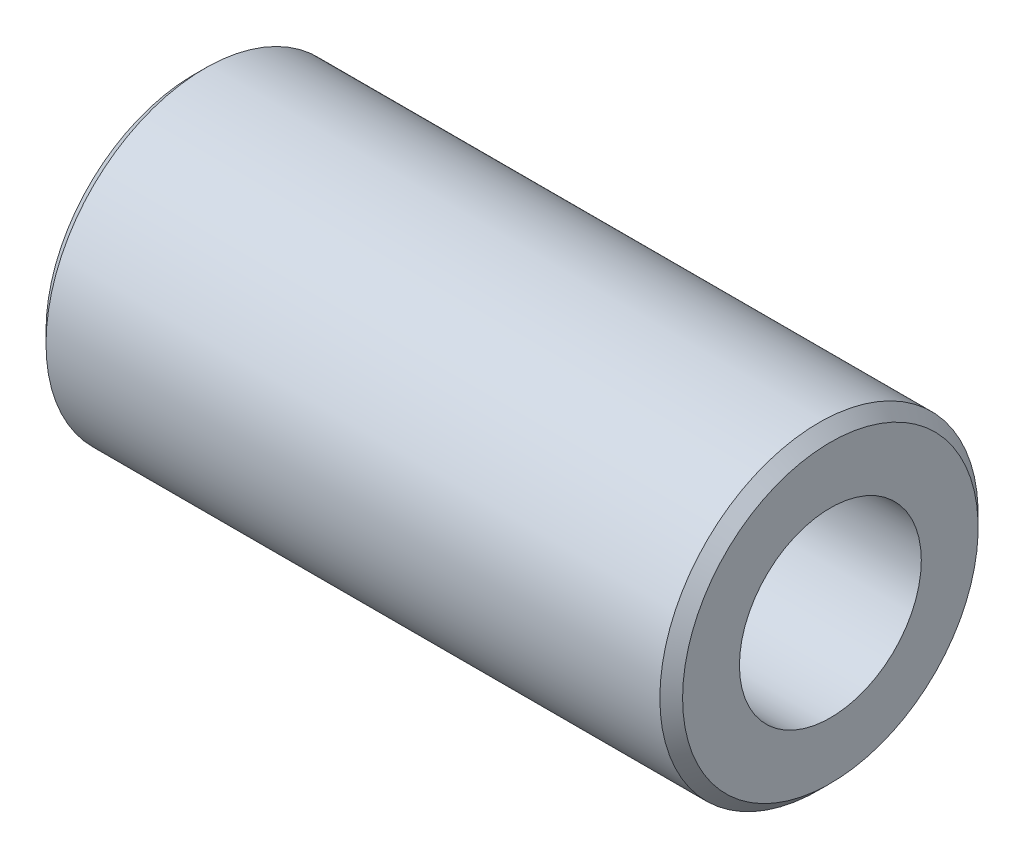
ISO-10303-21;
HEADER;
FILE_DESCRIPTION(('STEP AP214'),'2;1');
FILE_NAME('part.step','',(''),(''),'','','');
FILE_SCHEMA(('AUTOMOTIVE_DESIGN { 1 0 10303 214 1 1 1 1 }'));
ENDSEC;
DATA;
#1=APPLICATION_CONTEXT('core data for automotive mechanical design processes');
#2=APPLICATION_PROTOCOL_DEFINITION('international standard','automotive_design',2000,#1);
#3=PRODUCT_CONTEXT('',#1,'mechanical');
#4=PRODUCT('Part','Part','',(#3));
#5=PRODUCT_RELATED_PRODUCT_CATEGORY('part','',(#4));
#6=PRODUCT_DEFINITION_FORMATION('','',#4);
#7=PRODUCT_DEFINITION_CONTEXT('part definition',#1,'design');
#8=PRODUCT_DEFINITION('design','',#6,#7);
#9=PRODUCT_DEFINITION_SHAPE('','',#8);
#10=(LENGTH_UNIT() NAMED_UNIT(*) SI_UNIT(.MILLI.,.METRE.));
#11=(NAMED_UNIT(*) PLANE_ANGLE_UNIT() SI_UNIT($,.RADIAN.));
#12=(NAMED_UNIT(*) SI_UNIT($,.STERADIAN.) SOLID_ANGLE_UNIT());
#13=UNCERTAINTY_MEASURE_WITH_UNIT(LENGTH_MEASURE(1.E-05),#10,'distance_accuracy_value','');
#14=(GEOMETRIC_REPRESENTATION_CONTEXT(3) GLOBAL_UNCERTAINTY_ASSIGNED_CONTEXT((#13)) GLOBAL_UNIT_ASSIGNED_CONTEXT((#10,
#11,#12)) REPRESENTATION_CONTEXT('',''));
#15=CARTESIAN_POINT('',(0.,0.,0.));
#16=DIRECTION('',(0.,0.,1.));
#17=DIRECTION('',(1.,0.,0.));
#18=AXIS2_PLACEMENT_3D('',#15,#16,#17);
#19=CARTESIAN_POINT('',(14.,0.,0.));
#20=DIRECTION('',(-1.,0.,0.));
#21=DIRECTION('',(0.,0.,1.));
#22=AXIS2_PLACEMENT_3D('',#19,#20,#21);
#23=PLANE('',#22);
#24=CARTESIAN_POINT('',(14.,0.,0.));
#25=DIRECTION('',(-1.,0.,0.));
#26=DIRECTION('',(0.,0.,1.));
#27=AXIS2_PLACEMENT_3D('',#24,#25,#26);
#28=CIRCLE('',#27,6.5);
#29=CARTESIAN_POINT('',(14.,0.,6.5));
#30=VERTEX_POINT('',#29);
#31=EDGE_CURVE('E49',#30,#30,#28,.F.);
#32=ORIENTED_EDGE('',*,*,#31,.T.);
#33=EDGE_LOOP('',(#32));
#34=FACE_BOUND('',#33,.T.);
#35=CARTESIAN_POINT('',(14.,0.,0.));
#36=DIRECTION('',(1.,0.,0.));
#37=DIRECTION('',(0.,0.,-1.));
#38=AXIS2_PLACEMENT_3D('',#35,#36,#37);
#39=CIRCLE('',#38,4.);
#40=CARTESIAN_POINT('',(14.,0.,-4.));
#41=VERTEX_POINT('',#40);
#42=EDGE_CURVE('E57',#41,#41,#39,.T.);
#43=ORIENTED_EDGE('',*,*,#42,.F.);
#44=EDGE_LOOP('',(#43));
#45=FACE_BOUND('',#44,.T.);
#46=ADVANCED_FACE('F33',(#34,#45),#23,.F.);
#47=CARTESIAN_POINT('',(18.1256134157105,0.,0.));
#48=DIRECTION('',(1.,0.,0.));
#49=DIRECTION('',(0.,0.,-1.));
#50=AXIS2_PLACEMENT_3D('',#47,#48,#49);
#51=CYLINDRICAL_SURFACE('',#50,7.);
#52=CARTESIAN_POINT('',(13.5,0.,0.));
#53=DIRECTION('',(-1.,0.,0.));
#54=DIRECTION('',(0.,0.,1.));
#55=AXIS2_PLACEMENT_3D('',#52,#53,#54);
#56=CIRCLE('',#55,7.);
#57=CARTESIAN_POINT('',(13.5,0.,7.));
#58=VERTEX_POINT('',#57);
#59=EDGE_CURVE('E41',#58,#58,#56,.T.);
#60=ORIENTED_EDGE('',*,*,#59,.T.);
#61=EDGE_LOOP('',(#60));
#62=FACE_BOUND('',#61,.T.);
#63=CARTESIAN_POINT('',(-13.5,0.,0.));
#64=DIRECTION('',(-1.,0.,0.));
#65=DIRECTION('',(0.,0.,1.));
#66=AXIS2_PLACEMENT_3D('',#63,#64,#65);
#67=CIRCLE('',#66,7.);
#68=CARTESIAN_POINT('',(-13.5,0.,7.));
#69=VERTEX_POINT('',#68);
#70=EDGE_CURVE('E45',#69,#69,#67,.F.);
#71=ORIENTED_EDGE('',*,*,#70,.T.);
#72=EDGE_LOOP('',(#71));
#73=FACE_BOUND('',#72,.T.);
#74=ADVANCED_FACE('F65',(#62,#73),#51,.T.);
#75=CARTESIAN_POINT('',(-14.,0.,0.));
#76=DIRECTION('',(-1.,0.,0.));
#77=DIRECTION('',(0.,0.,1.));
#78=AXIS2_PLACEMENT_3D('',#75,#76,#77);
#79=PLANE('',#78);
#80=CARTESIAN_POINT('',(-14.,0.,0.));
#81=DIRECTION('',(-1.,0.,0.));
#82=DIRECTION('',(0.,0.,1.));
#83=AXIS2_PLACEMENT_3D('',#80,#81,#82);
#84=CIRCLE('',#83,6.50000000000001);
#85=CARTESIAN_POINT('',(-14.,0.,6.50000000000001));
#86=VERTEX_POINT('',#85);
#87=EDGE_CURVE('E10',#86,#86,#84,.T.);
#88=ORIENTED_EDGE('',*,*,#87,.T.);
#89=EDGE_LOOP('',(#88));
#90=FACE_BOUND('',#89,.T.);
#91=CARTESIAN_POINT('',(-14.,0.,0.));
#92=DIRECTION('',(1.,0.,0.));
#93=DIRECTION('',(0.,0.,-1.));
#94=AXIS2_PLACEMENT_3D('',#91,#92,#93);
#95=CIRCLE('',#94,4.);
#96=CARTESIAN_POINT('',(-14.,0.,-4.));
#97=VERTEX_POINT('',#96);
#98=EDGE_CURVE('E54',#97,#97,#95,.T.);
#99=ORIENTED_EDGE('',*,*,#98,.T.);
#100=EDGE_LOOP('',(#99));
#101=FACE_BOUND('',#100,.T.);
#102=ADVANCED_FACE('F71',(#90,#101),#79,.T.);
#103=CARTESIAN_POINT('',(18.1256134157105,0.,0.));
#104=DIRECTION('',(1.,0.,0.));
#105=DIRECTION('',(0.,0.,-1.));
#106=AXIS2_PLACEMENT_3D('',#103,#104,#105);
#107=CYLINDRICAL_SURFACE('',#106,4.);
#108=ORIENTED_EDGE('',*,*,#42,.T.);
#109=EDGE_LOOP('',(#108));
#110=FACE_BOUND('',#109,.T.);
#111=ORIENTED_EDGE('',*,*,#98,.F.);
#112=EDGE_LOOP('',(#111));
#113=FACE_BOUND('',#112,.T.);
#114=ADVANCED_FACE('F61',(#110,#113),#107,.F.);
#115=CARTESIAN_POINT('',(14.,0.,0.));
#116=DIRECTION('',(-1.,0.,0.));
#117=DIRECTION('',(0.,0.,1.));
#118=AXIS2_PLACEMENT_3D('',#115,#116,#117);
#119=CONICAL_SURFACE('',#118,6.5,0.785398163397444);
#120=ORIENTED_EDGE('',*,*,#59,.F.);
#121=EDGE_LOOP('',(#120));
#122=FACE_BOUND('',#121,.T.);
#123=ORIENTED_EDGE('',*,*,#31,.F.);
#124=EDGE_LOOP('',(#123));
#125=FACE_BOUND('',#124,.T.);
#126=ADVANCED_FACE('F75',(#122,#125),#119,.T.);
#127=CARTESIAN_POINT('',(-13.5,0.,0.));
#128=DIRECTION('',(1.,0.,0.));
#129=DIRECTION('',(0.,0.,-1.));
#130=AXIS2_PLACEMENT_3D('',#127,#128,#129);
#131=CONICAL_SURFACE('',#130,7.,0.785398163397442);
#132=ORIENTED_EDGE('',*,*,#87,.F.);
#133=EDGE_LOOP('',(#132));
#134=FACE_BOUND('',#133,.T.);
#135=ORIENTED_EDGE('',*,*,#70,.F.);
#136=EDGE_LOOP('',(#135));
#137=FACE_BOUND('',#136,.T.);
#138=ADVANCED_FACE('F36',(#134,#137),#131,.T.);
#139=CLOSED_SHELL('',(#46,#74,#102,#114,#126,#138));
#140=MANIFOLD_SOLID_BREP('B2',#139);
#141=ADVANCED_BREP_SHAPE_REPRESENTATION('',(#18,#140),#14);
#142=SHAPE_DEFINITION_REPRESENTATION(#9,#141);
ENDSEC;
END-ISO-10303-21;
